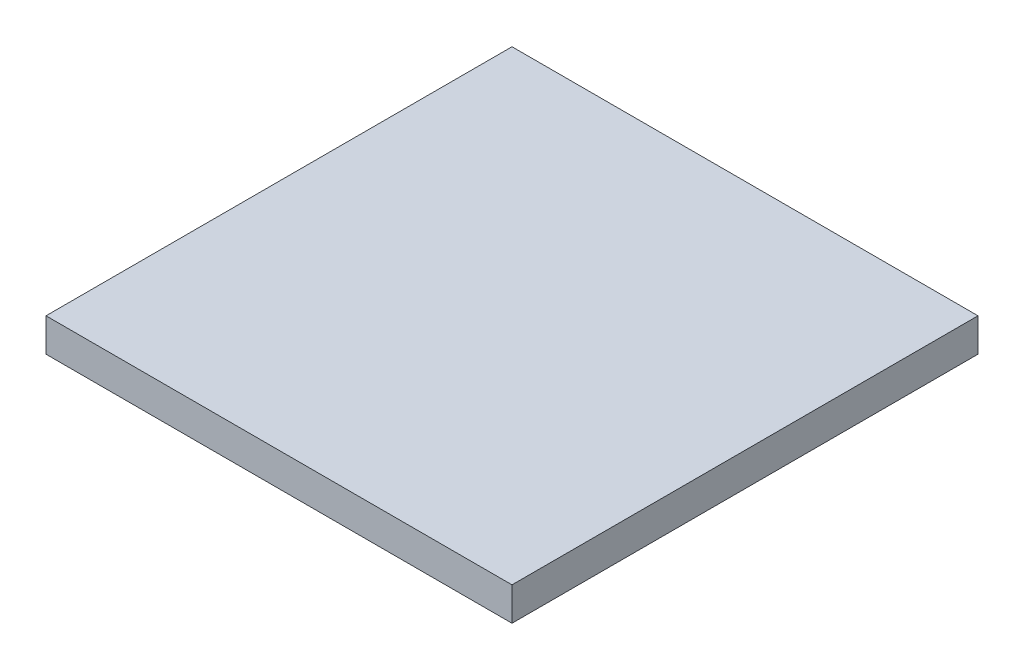
ISO-10303-21;
HEADER;
FILE_DESCRIPTION(('STEP AP214'),'2;1');
FILE_NAME('part.step','',(''),(''),'','','');
FILE_SCHEMA(('AUTOMOTIVE_DESIGN { 1 0 10303 214 1 1 1 1 }'));
ENDSEC;
DATA;
#1=APPLICATION_CONTEXT('core data for automotive mechanical design processes');
#2=APPLICATION_PROTOCOL_DEFINITION('international standard','automotive_design',2000,#1);
#3=PRODUCT_CONTEXT('',#1,'mechanical');
#4=PRODUCT('Part','Part','',(#3));
#5=PRODUCT_RELATED_PRODUCT_CATEGORY('part','',(#4));
#6=PRODUCT_DEFINITION_FORMATION('','',#4);
#7=PRODUCT_DEFINITION_CONTEXT('part definition',#1,'design');
#8=PRODUCT_DEFINITION('design','',#6,#7);
#9=PRODUCT_DEFINITION_SHAPE('','',#8);
#10=(LENGTH_UNIT() NAMED_UNIT(*) SI_UNIT(.MILLI.,.METRE.));
#11=(NAMED_UNIT(*) PLANE_ANGLE_UNIT() SI_UNIT($,.RADIAN.));
#12=(NAMED_UNIT(*) SI_UNIT($,.STERADIAN.) SOLID_ANGLE_UNIT());
#13=UNCERTAINTY_MEASURE_WITH_UNIT(LENGTH_MEASURE(1.E-05),#10,'distance_accuracy_value','');
#14=(GEOMETRIC_REPRESENTATION_CONTEXT(3) GLOBAL_UNCERTAINTY_ASSIGNED_CONTEXT((#13)) GLOBAL_UNIT_ASSIGNED_CONTEXT((#10,
#11,#12)) REPRESENTATION_CONTEXT('',''));
#15=CARTESIAN_POINT('',(0.,0.,0.));
#16=DIRECTION('',(0.,0.,1.));
#17=DIRECTION('',(1.,0.,0.));
#18=AXIS2_PLACEMENT_3D('',#15,#16,#17);
#19=CARTESIAN_POINT('',(0.,1.,0.));
#20=DIRECTION('',(1.,0.,0.));
#21=DIRECTION('',(0.,0.,-1.));
#22=AXIS2_PLACEMENT_3D('',#19,#20,#21);
#23=PLANE('',#22);
#24=DIRECTION('',(0.,0.,1.));
#25=VECTOR('',#24,1.);
#26=CARTESIAN_POINT('',(0.,0.,0.));
#27=LINE('',#26,#25);
#28=CARTESIAN_POINT('',(0.,0.,0.));
#29=VERTEX_POINT('',#28);
#30=CARTESIAN_POINT('',(0.,0.,14.));
#31=VERTEX_POINT('',#30);
#32=EDGE_CURVE('E109',#29,#31,#27,.T.);
#33=ORIENTED_EDGE('',*,*,#32,.T.);
#34=DIRECTION('',(0.,-1.,0.));
#35=VECTOR('',#34,1.);
#36=CARTESIAN_POINT('',(0.,1.,14.));
#37=LINE('',#36,#35);
#38=CARTESIAN_POINT('',(0.,1.,14.));
#39=VERTEX_POINT('',#38);
#40=EDGE_CURVE('E11',#39,#31,#37,.T.);
#41=ORIENTED_EDGE('',*,*,#40,.F.);
#42=DIRECTION('',(0.,0.,1.));
#43=VECTOR('',#42,1.);
#44=CARTESIAN_POINT('',(0.,1.,0.));
#45=LINE('',#44,#43);
#46=CARTESIAN_POINT('',(0.,1.,0.));
#47=VERTEX_POINT('',#46);
#48=EDGE_CURVE('E93',#47,#39,#45,.T.);
#49=ORIENTED_EDGE('',*,*,#48,.F.);
#50=DIRECTION('',(0.,-1.,0.));
#51=VECTOR('',#50,1.);
#52=CARTESIAN_POINT('',(0.,1.,0.));
#53=LINE('',#52,#51);
#54=EDGE_CURVE('E105',#47,#29,#53,.T.);
#55=ORIENTED_EDGE('',*,*,#54,.T.);
#56=EDGE_LOOP('',(#33,#41,#49,#55));
#57=FACE_BOUND('',#56,.T.);
#58=ADVANCED_FACE('F41',(#57),#23,.F.);
#59=CARTESIAN_POINT('',(0.,1.,14.));
#60=DIRECTION('',(0.,0.,-1.));
#61=DIRECTION('',(-1.,0.,0.));
#62=AXIS2_PLACEMENT_3D('',#59,#60,#61);
#63=PLANE('',#62);
#64=DIRECTION('',(1.,0.,0.));
#65=VECTOR('',#64,1.);
#66=CARTESIAN_POINT('',(0.,0.,14.));
#67=LINE('',#66,#65);
#68=CARTESIAN_POINT('',(14.,0.,14.));
#69=VERTEX_POINT('',#68);
#70=EDGE_CURVE('E98',#31,#69,#67,.T.);
#71=ORIENTED_EDGE('',*,*,#70,.T.);
#72=DIRECTION('',(0.,-1.,0.));
#73=VECTOR('',#72,1.);
#74=CARTESIAN_POINT('',(14.,1.,14.));
#75=LINE('',#74,#73);
#76=CARTESIAN_POINT('',(14.,1.,14.));
#77=VERTEX_POINT('',#76);
#78=EDGE_CURVE('E50',#77,#69,#75,.T.);
#79=ORIENTED_EDGE('',*,*,#78,.F.);
#80=DIRECTION('',(1.,0.,0.));
#81=VECTOR('',#80,1.);
#82=CARTESIAN_POINT('',(0.,1.,14.));
#83=LINE('',#82,#81);
#84=EDGE_CURVE('E88',#39,#77,#83,.T.);
#85=ORIENTED_EDGE('',*,*,#84,.F.);
#86=ORIENTED_EDGE('',*,*,#40,.T.);
#87=EDGE_LOOP('',(#71,#79,#85,#86));
#88=FACE_BOUND('',#87,.T.);
#89=ADVANCED_FACE('F97',(#88),#63,.F.);
#90=CARTESIAN_POINT('',(14.,1.,0.));
#91=DIRECTION('',(-1.,0.,0.));
#92=DIRECTION('',(0.,0.,1.));
#93=AXIS2_PLACEMENT_3D('',#90,#91,#92);
#94=PLANE('',#93);
#95=DIRECTION('',(0.,0.,-1.));
#96=VECTOR('',#95,1.);
#97=CARTESIAN_POINT('',(14.,0.,0.));
#98=LINE('',#97,#96);
#99=CARTESIAN_POINT('',(14.,0.,0.));
#100=VERTEX_POINT('',#99);
#101=EDGE_CURVE('E75',#69,#100,#98,.T.);
#102=ORIENTED_EDGE('',*,*,#101,.T.);
#103=DIRECTION('',(0.,-1.,0.));
#104=VECTOR('',#103,1.);
#105=CARTESIAN_POINT('',(14.,1.,0.));
#106=LINE('',#105,#104);
#107=CARTESIAN_POINT('',(14.,1.,0.));
#108=VERTEX_POINT('',#107);
#109=EDGE_CURVE('E100',#108,#100,#106,.T.);
#110=ORIENTED_EDGE('',*,*,#109,.F.);
#111=DIRECTION('',(0.,0.,-1.));
#112=VECTOR('',#111,1.);
#113=CARTESIAN_POINT('',(14.,1.,0.));
#114=LINE('',#113,#112);
#115=EDGE_CURVE('E91',#77,#108,#114,.T.);
#116=ORIENTED_EDGE('',*,*,#115,.F.);
#117=ORIENTED_EDGE('',*,*,#78,.T.);
#118=EDGE_LOOP('',(#102,#110,#116,#117));
#119=FACE_BOUND('',#118,.T.);
#120=ADVANCED_FACE('F101',(#119),#94,.F.);
#121=CARTESIAN_POINT('',(0.,1.,0.));
#122=DIRECTION('',(0.,0.,1.));
#123=DIRECTION('',(1.,0.,0.));
#124=AXIS2_PLACEMENT_3D('',#121,#122,#123);
#125=PLANE('',#124);
#126=DIRECTION('',(-1.,0.,0.));
#127=VECTOR('',#126,1.);
#128=CARTESIAN_POINT('',(0.,0.,0.));
#129=LINE('',#128,#127);
#130=EDGE_CURVE('E81',#100,#29,#129,.T.);
#131=ORIENTED_EDGE('',*,*,#130,.T.);
#132=ORIENTED_EDGE('',*,*,#54,.F.);
#133=DIRECTION('',(-1.,0.,0.));
#134=VECTOR('',#133,1.);
#135=CARTESIAN_POINT('',(0.,1.,0.));
#136=LINE('',#135,#134);
#137=EDGE_CURVE('E58',#108,#47,#136,.T.);
#138=ORIENTED_EDGE('',*,*,#137,.F.);
#139=ORIENTED_EDGE('',*,*,#109,.T.);
#140=EDGE_LOOP('',(#131,#132,#138,#139));
#141=FACE_BOUND('',#140,.T.);
#142=ADVANCED_FACE('F122',(#141),#125,.F.);
#143=CARTESIAN_POINT('',(0.,1.,0.));
#144=DIRECTION('',(0.,1.,0.));
#145=DIRECTION('',(0.,0.,1.));
#146=AXIS2_PLACEMENT_3D('',#143,#144,#145);
#147=PLANE('',#146);
#148=ORIENTED_EDGE('',*,*,#48,.T.);
#149=ORIENTED_EDGE('',*,*,#84,.T.);
#150=ORIENTED_EDGE('',*,*,#115,.T.);
#151=ORIENTED_EDGE('',*,*,#137,.T.);
#152=EDGE_LOOP('',(#148,#149,#150,#151));
#153=FACE_BOUND('',#152,.T.);
#154=ADVANCED_FACE('F89',(#153),#147,.T.);
#155=CARTESIAN_POINT('',(0.,0.,0.));
#156=DIRECTION('',(0.,1.,0.));
#157=DIRECTION('',(0.,0.,1.));
#158=AXIS2_PLACEMENT_3D('',#155,#156,#157);
#159=PLANE('',#158);
#160=ORIENTED_EDGE('',*,*,#32,.F.);
#161=ORIENTED_EDGE('',*,*,#130,.F.);
#162=ORIENTED_EDGE('',*,*,#101,.F.);
#163=ORIENTED_EDGE('',*,*,#70,.F.);
#164=EDGE_LOOP('',(#160,#161,#162,#163));
#165=FACE_BOUND('',#164,.T.);
#166=ADVANCED_FACE('F125',(#165),#159,.F.);
#167=CLOSED_SHELL('',(#58,#89,#120,#142,#154,#166));
#168=MANIFOLD_SOLID_BREP('B2',#167);
#169=ADVANCED_BREP_SHAPE_REPRESENTATION('',(#18,#168),#14);
#170=SHAPE_DEFINITION_REPRESENTATION(#9,#169);
ENDSEC;
END-ISO-10303-21;
